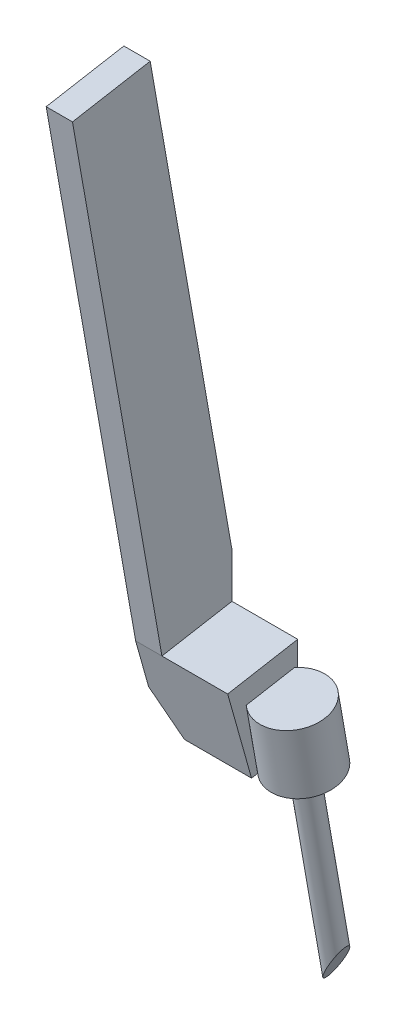
ISO-10303-21;
HEADER;
FILE_DESCRIPTION(('STEP AP214'),'2;1');
FILE_NAME('part.step','',(''),(''),'','','');
FILE_SCHEMA(('AUTOMOTIVE_DESIGN { 1 0 10303 214 1 1 1 1 }'));
ENDSEC;
DATA;
#1=APPLICATION_CONTEXT('core data for automotive mechanical design processes');
#2=APPLICATION_PROTOCOL_DEFINITION('international standard','automotive_design',2000,#1);
#3=PRODUCT_CONTEXT('',#1,'mechanical');
#4=PRODUCT('Part','Part','',(#3));
#5=PRODUCT_RELATED_PRODUCT_CATEGORY('part','',(#4));
#6=PRODUCT_DEFINITION_FORMATION('','',#4);
#7=PRODUCT_DEFINITION_CONTEXT('part definition',#1,'design');
#8=PRODUCT_DEFINITION('design','',#6,#7);
#9=PRODUCT_DEFINITION_SHAPE('','',#8);
#10=(LENGTH_UNIT() NAMED_UNIT(*) SI_UNIT(.MILLI.,.METRE.));
#11=(NAMED_UNIT(*) PLANE_ANGLE_UNIT() SI_UNIT($,.RADIAN.));
#12=(NAMED_UNIT(*) SI_UNIT($,.STERADIAN.) SOLID_ANGLE_UNIT());
#13=UNCERTAINTY_MEASURE_WITH_UNIT(LENGTH_MEASURE(1.E-05),#10,'distance_accuracy_value','');
#14=(GEOMETRIC_REPRESENTATION_CONTEXT(3) GLOBAL_UNCERTAINTY_ASSIGNED_CONTEXT((#13)) GLOBAL_UNIT_ASSIGNED_CONTEXT((#10,
#11,#12)) REPRESENTATION_CONTEXT('',''));
#15=CARTESIAN_POINT('',(0.,0.,0.));
#16=DIRECTION('',(0.,0.,1.));
#17=DIRECTION('',(1.,0.,0.));
#18=AXIS2_PLACEMENT_3D('',#15,#16,#17);
#19=CARTESIAN_POINT('',(-66.04,78.2084154122397,31.8445389149622));
#20=DIRECTION('',(0.,0.984807753012208,0.17364817766693));
#21=DIRECTION('',(0.,-0.17364817766693,0.984807753012208));
#22=AXIS2_PLACEMENT_3D('',#19,#20,#21);
#23=PLANE('',#22);
#24=DIRECTION('',(-1.,0.,0.));
#25=VECTOR('',#24,1.);
#26=CARTESIAN_POINT('',(-66.04,82.9277257491693,5.08));
#27=LINE('',#26,#25);
#28=CARTESIAN_POINT('',(-16.5707845942965,82.9277257491693,5.08));
#29=VERTEX_POINT('',#28);
#30=CARTESIAN_POINT('',(-51.5829650001151,82.9277257491693,5.08));
#31=VERTEX_POINT('',#30);
#32=EDGE_CURVE('E172',#29,#31,#27,.T.);
#33=ORIENTED_EDGE('',*,*,#32,.F.);
#34=CARTESIAN_POINT('',(0.,81.2958800111578,14.3346570664051));
#35=DIRECTION('',(0.,0.984807753012208,0.17364817766693));
#36=DIRECTION('',(0.,-0.17364817766693,0.984807753012208));
#37=AXIS2_PLACEMENT_3D('',#34,#35,#36);
#38=CIRCLE('',#37,19.05);
#39=CARTESIAN_POINT('',(-12.7,78.8302440392632,28.3179735276063));
#40=VERTEX_POINT('',#39);
#41=EDGE_CURVE('E117',#40,#29,#38,.T.);
#42=ORIENTED_EDGE('',*,*,#41,.F.);
#43=DIRECTION('',(0.,-0.17364817766693,0.984807753012208));
#44=VECTOR('',#43,1.);
#45=CARTESIAN_POINT('',(-12.7,78.2084154122398,31.8445389149622));
#46=LINE('',#45,#44);
#47=CARTESIAN_POINT('',(-12.7,78.2084154122398,31.8445389149622));
#48=VERTEX_POINT('',#47);
#49=EDGE_CURVE('E112',#40,#48,#46,.T.);
#50=ORIENTED_EDGE('',*,*,#49,.T.);
#51=DIRECTION('',(1.,0.,0.));
#52=VECTOR('',#51,1.);
#53=CARTESIAN_POINT('',(-66.04,78.2084154122397,31.8445389149622));
#54=LINE('',#53,#52);
#55=CARTESIAN_POINT('',(-51.5829650001151,78.2084154122397,31.8445389149622));
#56=VERTEX_POINT('',#55);
#57=EDGE_CURVE('E196',#56,#48,#54,.T.);
#58=ORIENTED_EDGE('',*,*,#57,.F.);
#59=DIRECTION('',(0.,0.17364817766693,-0.984807753012208));
#60=VECTOR('',#59,1.);
#61=CARTESIAN_POINT('',(-51.5829650001151,78.2084154122397,31.8445389149622));
#62=LINE('',#61,#60);
#63=EDGE_CURVE('E163',#56,#31,#62,.T.);
#64=ORIENTED_EDGE('',*,*,#63,.T.);
#65=EDGE_LOOP('',(#33,#42,#50,#58,#64));
#66=FACE_BOUND('',#65,.T.);
#67=CARTESIAN_POINT('',(0.,81.2958800111578,14.3346570664051));
#68=DIRECTION('',(0.,0.984807753012208,0.17364817766693));
#69=DIRECTION('',(0.,-0.17364817766693,0.984807753012208));
#70=AXIS2_PLACEMENT_3D('',#67,#68,#69);
#71=CIRCLE('',#70,6.5);
#72=CARTESIAN_POINT('',(0.,80.1671668563227,20.7359074609845));
#73=VERTEX_POINT('',#72);
#74=EDGE_CURVE('E11',#73,#73,#71,.F.);
#75=ORIENTED_EDGE('',*,*,#74,.F.);
#76=EDGE_LOOP('',(#75));
#77=FACE_BOUND('',#76,.T.);
#78=ADVANCED_FACE('F34',(#66,#77),#23,.F.);
#79=CARTESIAN_POINT('',(-37.9019976077163,107.832873361256,5.08));
#80=DIRECTION('',(0.,0.,-1.));
#81=DIRECTION('',(-1.,0.,0.));
#82=AXIS2_PLACEMENT_3D('',#79,#80,#81);
#83=PLANE('',#82);
#84=CARTESIAN_POINT('',(0.,28.810111643658,5.08));
#85=DIRECTION('',(0.,0.,-1.));
#86=DIRECTION('',(0.,1.,0.));
#87=AXIS2_PLACEMENT_3D('',#84,#85,#86);
#88=ELLIPSE('',#87,109.704577703886,19.05);
#89=CARTESIAN_POINT('',(-12.7,110.579076039924,5.08000000000002));
#90=VERTEX_POINT('',#89);
#91=EDGE_CURVE('E133',#29,#90,#88,.T.);
#92=ORIENTED_EDGE('',*,*,#91,.F.);
#93=ORIENTED_EDGE('',*,*,#32,.T.);
#94=DIRECTION('',(0.524092216345197,-0.851661522417433,0.));
#95=VECTOR('',#94,1.);
#96=CARTESIAN_POINT('',(-58.9415695014176,94.8856219304001,5.08));
#97=LINE('',#96,#95);
#98=CARTESIAN_POINT('',(-66.04,106.420729563472,5.08));
#99=VERTEX_POINT('',#98);
#100=EDGE_CURVE('E166',#99,#31,#97,.T.);
#101=ORIENTED_EDGE('',*,*,#100,.F.);
#102=DIRECTION('',(0.,1.,0.));
#103=VECTOR('',#102,1.);
#104=CARTESIAN_POINT('',(-66.04,0.,5.08));
#105=LINE('',#104,#103);
#106=CARTESIAN_POINT('',(-66.04,160.455604888321,5.08000000000001));
#107=VERTEX_POINT('',#106);
#108=EDGE_CURVE('E201',#99,#107,#105,.T.);
#109=ORIENTED_EDGE('',*,*,#108,.T.);
#110=DIRECTION('',(1.,0.,0.));
#111=VECTOR('',#110,1.);
#112=CARTESIAN_POINT('',(-66.04,160.455604888321,5.08));
#113=LINE('',#112,#111);
#114=CARTESIAN_POINT('',(-50.8,160.455604888321,5.08));
#115=VERTEX_POINT('',#114);
#116=EDGE_CURVE('E169',#107,#115,#113,.T.);
#117=ORIENTED_EDGE('',*,*,#116,.T.);
#118=DIRECTION('',(0.,1.,0.));
#119=VECTOR('',#118,1.);
#120=CARTESIAN_POINT('',(-50.8,107.832873361256,5.08));
#121=LINE('',#120,#119);
#122=CARTESIAN_POINT('',(-50.8,134.511397632965,5.08));
#123=VERTEX_POINT('',#122);
#124=EDGE_CURVE('E158',#123,#115,#121,.T.);
#125=ORIENTED_EDGE('',*,*,#124,.F.);
#126=DIRECTION('',(-1.,0.,0.));
#127=VECTOR('',#126,1.);
#128=CARTESIAN_POINT('',(-37.9019976077163,134.511397632965,5.08));
#129=LINE('',#128,#127);
#130=CARTESIAN_POINT('',(-12.7,134.511397632965,5.08));
#131=VERTEX_POINT('',#130);
#132=EDGE_CURVE('E156',#131,#123,#129,.T.);
#133=ORIENTED_EDGE('',*,*,#132,.F.);
#134=DIRECTION('',(0.,1.,0.));
#135=VECTOR('',#134,1.);
#136=CARTESIAN_POINT('',(-12.7,107.832873361256,5.08));
#137=LINE('',#136,#135);
#138=EDGE_CURVE('E199',#90,#131,#137,.T.);
#139=ORIENTED_EDGE('',*,*,#138,.F.);
#140=EDGE_LOOP('',(#92,#93,#101,#109,#117,#125,#133,#139));
#141=FACE_BOUND('',#140,.T.);
#142=CARTESIAN_POINT('',(-37.9019976077163,107.832873361256,5.08));
#143=DIRECTION('',(0.,0.,-1.));
#144=DIRECTION('',(-1.,0.,0.));
#145=AXIS2_PLACEMENT_3D('',#142,#143,#144);
#146=CIRCLE('',#145,24.);
#147=CARTESIAN_POINT('',(-61.9019976077163,107.832873361256,5.08));
#148=VERTEX_POINT('',#147);
#149=EDGE_CURVE('E135',#148,#148,#146,.T.);
#150=ORIENTED_EDGE('',*,*,#149,.F.);
#151=EDGE_LOOP('',(#150));
#152=FACE_BOUND('',#151,.T.);
#153=ADVANCED_FACE('F36',(#141,#152),#83,.T.);
#154=CARTESIAN_POINT('',(-12.7,0.,0.));
#155=DIRECTION('',(1.,0.,0.));
#156=DIRECTION('',(0.,1.,0.));
#157=AXIS2_PLACEMENT_3D('',#154,#155,#156);
#158=PLANE('',#157);
#159=DIRECTION('',(0.,0.984807753012208,0.17364817766693));
#160=VECTOR('',#159,1.);
#161=CARTESIAN_POINT('',(-12.7,83.7615159830524,0.351340605203934));
#162=LINE('',#161,#160);
#163=CARTESIAN_POINT('',(-12.7,121.282691372818,6.96733617431399));
#164=VERTEX_POINT('',#163);
#165=EDGE_CURVE('E52',#90,#164,#162,.T.);
#166=ORIENTED_EDGE('',*,*,#165,.F.);
#167=ORIENTED_EDGE('',*,*,#138,.T.);
#168=DIRECTION('',(0.,0.17364817766693,-0.984807753012208));
#169=VECTOR('',#168,1.);
#170=CARTESIAN_POINT('',(-12.7,135.293711205644,0.643279258026118));
#171=LINE('',#170,#169);
#172=CARTESIAN_POINT('',(-12.7,127.354516522712,45.6686897257443));
#173=VERTEX_POINT('',#172);
#174=EDGE_CURVE('E139',#173,#131,#171,.T.);
#175=ORIENTED_EDGE('',*,*,#174,.F.);
#176=DIRECTION('',(0.,0.962641699975202,0.270778428736215));
#177=VECTOR('',#176,1.);
#178=CARTESIAN_POINT('',(-12.7,78.2084154122398,31.8445389149622));
#179=LINE('',#178,#177);
#180=EDGE_CURVE('E177',#48,#173,#179,.T.);
#181=ORIENTED_EDGE('',*,*,#180,.F.);
#182=ORIENTED_EDGE('',*,*,#49,.F.);
#183=DIRECTION('',(0.,0.984807753012208,0.17364817766693));
#184=VECTOR('',#183,1.);
#185=CARTESIAN_POINT('',(-12.7,78.8302440392633,28.3179735276063));
#186=LINE('',#185,#184);
#187=CARTESIAN_POINT('',(-12.7,116.351419429028,34.9339690967163));
#188=VERTEX_POINT('',#187);
#189=EDGE_CURVE('E109',#188,#40,#186,.F.);
#190=ORIENTED_EDGE('',*,*,#189,.F.);
#191=DIRECTION('',(0.,-0.17364817766693,0.984807753012208));
#192=VECTOR('',#191,1.);
#193=CARTESIAN_POINT('',(-12.7,118.817055400923,20.9506526355152));
#194=LINE('',#193,#192);
#195=EDGE_CURVE('E42',#164,#188,#194,.T.);
#196=ORIENTED_EDGE('',*,*,#195,.F.);
#197=EDGE_LOOP('',(#166,#167,#175,#181,#182,#190,#196));
#198=FACE_BOUND('',#197,.T.);
#199=ADVANCED_FACE('F110',(#198),#158,.T.);
#200=CARTESIAN_POINT('',(-66.04,135.293711205644,0.643279258026118));
#201=DIRECTION('',(0.,-0.17364817766693,0.984807753012208));
#202=DIRECTION('',(0.,-0.984807753012208,-0.17364817766693));
#203=AXIS2_PLACEMENT_3D('',#200,#201,#202);
#204=PLANE('',#203);
#205=DIRECTION('',(1.,0.,0.));
#206=VECTOR('',#205,1.);
#207=CARTESIAN_POINT('',(-66.0400000000001,429.209585092138,52.4685778827215));
#208=LINE('',#207,#206);
#209=CARTESIAN_POINT('',(-66.0400000000001,429.209585092138,52.4685778827215));
#210=VERTEX_POINT('',#209);
#211=CARTESIAN_POINT('',(-50.8000000000001,429.209585092138,52.4685778827215));
#212=VERTEX_POINT('',#211);
#213=EDGE_CURVE('E184',#210,#212,#208,.T.);
#214=ORIENTED_EDGE('',*,*,#213,.T.);
#215=DIRECTION('',(0.,0.984807753012208,0.173648177666931));
#216=VECTOR('',#215,1.);
#217=CARTESIAN_POINT('',(-50.8000000000001,429.209585092138,52.4685778827215));
#218=LINE('',#217,#216);
#219=EDGE_CURVE('E148',#115,#212,#218,.T.);
#220=ORIENTED_EDGE('',*,*,#219,.F.);
#221=ORIENTED_EDGE('',*,*,#116,.F.);
#222=DIRECTION('',(0.,-0.984807753012208,-0.173648177666931));
#223=VECTOR('',#222,1.);
#224=CARTESIAN_POINT('',(-66.04,135.293711205644,0.643279258026118));
#225=LINE('',#224,#223);
#226=EDGE_CURVE('E181',#210,#107,#225,.T.);
#227=ORIENTED_EDGE('',*,*,#226,.F.);
#228=EDGE_LOOP('',(#214,#220,#221,#227));
#229=FACE_BOUND('',#228,.T.);
#230=ADVANCED_FACE('F237',(#229),#204,.F.);
#231=CARTESIAN_POINT('',(-66.04,0.,0.));
#232=DIRECTION('',(1.,0.,0.));
#233=DIRECTION('',(0.,1.,0.));
#234=AXIS2_PLACEMENT_3D('',#231,#232,#233);
#235=PLANE('',#234);
#236=ORIENTED_EDGE('',*,*,#108,.F.);
#237=DIRECTION('',(0.,-0.17364817766693,0.984807753012208));
#238=VECTOR('',#237,1.);
#239=CARTESIAN_POINT('',(-66.04,104.080483080507,18.3521973322643));
#240=LINE('',#239,#238);
#241=CARTESIAN_POINT('',(-66.04,100.591264455003,38.1405394877563));
#242=VERTEX_POINT('',#241);
#243=EDGE_CURVE('E160',#99,#242,#240,.T.);
#244=ORIENTED_EDGE('',*,*,#243,.T.);
#245=DIRECTION('',(0.,0.962641699975202,0.270778428736215));
#246=VECTOR('',#245,1.);
#247=CARTESIAN_POINT('',(-66.04,78.2084154122397,31.8445389149622));
#248=LINE('',#247,#246);
#249=CARTESIAN_POINT('',(-66.04,127.354516522712,45.6686897257443));
#250=VERTEX_POINT('',#249);
#251=EDGE_CURVE('E174',#242,#250,#248,.T.);
#252=ORIENTED_EDGE('',*,*,#251,.T.);
#253=DIRECTION('',(0.,0.984807753012208,0.17364817766693));
#254=VECTOR('',#253,1.);
#255=CARTESIAN_POINT('',(-66.04,127.354516522712,45.6686897257443));
#256=LINE('',#255,#254);
#257=CARTESIAN_POINT('',(-66.0400000000001,421.270390409205,97.4939883504397));
#258=VERTEX_POINT('',#257);
#259=EDGE_CURVE('E176',#250,#258,#256,.T.);
#260=ORIENTED_EDGE('',*,*,#259,.T.);
#261=DIRECTION('',(0.,0.173648177666931,-0.984807753012208));
#262=VECTOR('',#261,1.);
#263=CARTESIAN_POINT('',(-66.0400000000001,421.270390409205,97.4939883504397));
#264=LINE('',#263,#262);
#265=EDGE_CURVE('E179',#258,#210,#264,.T.);
#266=ORIENTED_EDGE('',*,*,#265,.T.);
#267=ORIENTED_EDGE('',*,*,#226,.T.);
#268=EDGE_LOOP('',(#236,#244,#252,#260,#266,#267));
#269=FACE_BOUND('',#268,.T.);
#270=ADVANCED_FACE('F230',(#269),#235,.F.);
#271=CARTESIAN_POINT('',(-66.04,78.2084154122397,31.8445389149622));
#272=DIRECTION('',(0.,0.270778428736215,-0.962641699975202));
#273=DIRECTION('',(0.,0.962641699975202,0.270778428736215));
#274=AXIS2_PLACEMENT_3D('',#271,#272,#273);
#275=PLANE('',#274);
#276=ORIENTED_EDGE('',*,*,#251,.F.);
#277=DIRECTION('',(0.528023929906921,-0.817503721486964,-0.229953027378672));
#278=VECTOR('',#277,1.);
#279=CARTESIAN_POINT('',(-55.6137203828117,84.4489612267807,33.5999222420727));
#280=LINE('',#279,#278);
#281=EDGE_CURVE('E123',#242,#56,#280,.T.);
#282=ORIENTED_EDGE('',*,*,#281,.T.);
#283=ORIENTED_EDGE('',*,*,#57,.T.);
#284=ORIENTED_EDGE('',*,*,#180,.T.);
#285=DIRECTION('',(1.,0.,0.));
#286=VECTOR('',#285,1.);
#287=CARTESIAN_POINT('',(-50.8,127.354516522712,45.6686897257443));
#288=LINE('',#287,#286);
#289=CARTESIAN_POINT('',(-50.8,127.354516522712,45.6686897257443));
#290=VERTEX_POINT('',#289);
#291=EDGE_CURVE('E152',#290,#173,#288,.T.);
#292=ORIENTED_EDGE('',*,*,#291,.F.);
#293=DIRECTION('',(1.,0.,0.));
#294=VECTOR('',#293,1.);
#295=CARTESIAN_POINT('',(-66.04,127.354516522712,45.6686897257443));
#296=LINE('',#295,#294);
#297=EDGE_CURVE('E193',#250,#290,#296,.T.);
#298=ORIENTED_EDGE('',*,*,#297,.F.);
#299=EDGE_LOOP('',(#276,#282,#283,#284,#292,#298));
#300=FACE_BOUND('',#299,.T.);
#301=ADVANCED_FACE('F207',(#300),#275,.F.);
#302=CARTESIAN_POINT('',(-66.04,127.354516522712,45.6686897257443));
#303=DIRECTION('',(0.,0.17364817766693,-0.984807753012208));
#304=DIRECTION('',(0.,0.984807753012208,0.17364817766693));
#305=AXIS2_PLACEMENT_3D('',#302,#303,#304);
#306=PLANE('',#305);
#307=ORIENTED_EDGE('',*,*,#297,.T.);
#308=DIRECTION('',(0.,-0.984807753012208,-0.17364817766693));
#309=VECTOR('',#308,1.);
#310=CARTESIAN_POINT('',(-50.8,127.354516522712,45.6686897257443));
#311=LINE('',#310,#309);
#312=CARTESIAN_POINT('',(-50.8000000000001,421.270390409205,97.4939883504397));
#313=VERTEX_POINT('',#312);
#314=EDGE_CURVE('E142',#313,#290,#311,.T.);
#315=ORIENTED_EDGE('',*,*,#314,.F.);
#316=DIRECTION('',(1.,0.,0.));
#317=VECTOR('',#316,1.);
#318=CARTESIAN_POINT('',(-66.0400000000001,421.270390409205,97.4939883504397));
#319=LINE('',#318,#317);
#320=EDGE_CURVE('E190',#258,#313,#319,.T.);
#321=ORIENTED_EDGE('',*,*,#320,.F.);
#322=ORIENTED_EDGE('',*,*,#259,.F.);
#323=EDGE_LOOP('',(#307,#315,#321,#322));
#324=FACE_BOUND('',#323,.T.);
#325=ADVANCED_FACE('F225',(#324),#306,.F.);
#326=CARTESIAN_POINT('',(-66.0400000000001,421.270390409205,97.4939883504397));
#327=DIRECTION('',(0.,-0.984807753012208,-0.173648177666931));
#328=DIRECTION('',(0.,0.173648177666931,-0.984807753012208));
#329=AXIS2_PLACEMENT_3D('',#326,#327,#328);
#330=PLANE('',#329);
#331=ORIENTED_EDGE('',*,*,#320,.T.);
#332=DIRECTION('',(0.,-0.173648177666931,0.984807753012208));
#333=VECTOR('',#332,1.);
#334=CARTESIAN_POINT('',(-50.8000000000001,421.270390409205,97.4939883504397));
#335=LINE('',#334,#333);
#336=EDGE_CURVE('E150',#212,#313,#335,.T.);
#337=ORIENTED_EDGE('',*,*,#336,.F.);
#338=ORIENTED_EDGE('',*,*,#213,.F.);
#339=ORIENTED_EDGE('',*,*,#265,.F.);
#340=EDGE_LOOP('',(#331,#337,#338,#339));
#341=FACE_BOUND('',#340,.T.);
#342=ADVANCED_FACE('F242',(#341),#330,.F.);
#343=CARTESIAN_POINT('',(0.,12.832245373223,-72.775279890033));
#344=DIRECTION('',(0.848048096156425,0.521868599887386,0.0920195145446967));
#345=DIRECTION('',(-0.524092216345197,0.851661522417433,0.));
#346=AXIS2_PLACEMENT_3D('',#343,#344,#345);
#347=PLANE('',#346);
#348=ORIENTED_EDGE('',*,*,#100,.T.);
#349=ORIENTED_EDGE('',*,*,#63,.F.);
#350=ORIENTED_EDGE('',*,*,#281,.F.);
#351=ORIENTED_EDGE('',*,*,#243,.F.);
#352=EDGE_LOOP('',(#348,#349,#350,#351));
#353=FACE_BOUND('',#352,.T.);
#354=ADVANCED_FACE('F232',(#353),#347,.F.);
#355=CARTESIAN_POINT('',(-50.8,135.293711205644,0.643279258026118));
#356=DIRECTION('',(0.,-0.984807753012208,-0.17364817766693));
#357=DIRECTION('',(0.,0.17364817766693,-0.984807753012208));
#358=AXIS2_PLACEMENT_3D('',#355,#356,#357);
#359=PLANE('',#358);
#360=ORIENTED_EDGE('',*,*,#132,.T.);
#361=DIRECTION('',(0.,0.17364817766693,-0.984807753012208));
#362=VECTOR('',#361,1.);
#363=CARTESIAN_POINT('',(-50.8,135.293711205644,0.643279258026118));
#364=LINE('',#363,#362);
#365=EDGE_CURVE('E145',#290,#123,#364,.T.);
#366=ORIENTED_EDGE('',*,*,#365,.F.);
#367=ORIENTED_EDGE('',*,*,#291,.T.);
#368=ORIENTED_EDGE('',*,*,#174,.T.);
#369=EDGE_LOOP('',(#360,#366,#367,#368));
#370=FACE_BOUND('',#369,.T.);
#371=ADVANCED_FACE('F220',(#370),#359,.F.);
#372=CARTESIAN_POINT('',(-50.8,0.,0.));
#373=DIRECTION('',(-1.,0.,0.));
#374=DIRECTION('',(0.,-1.,0.));
#375=AXIS2_PLACEMENT_3D('',#372,#373,#374);
#376=PLANE('',#375);
#377=ORIENTED_EDGE('',*,*,#124,.T.);
#378=ORIENTED_EDGE('',*,*,#219,.T.);
#379=ORIENTED_EDGE('',*,*,#336,.T.);
#380=ORIENTED_EDGE('',*,*,#314,.T.);
#381=ORIENTED_EDGE('',*,*,#365,.T.);
#382=EDGE_LOOP('',(#377,#378,#379,#380,#381));
#383=FACE_BOUND('',#382,.T.);
#384=ADVANCED_FACE('F240',(#383),#376,.F.);
#385=CARTESIAN_POINT('',(-37.9019976077163,107.832873361256,4.826));
#386=DIRECTION('',(0.,0.,1.));
#387=DIRECTION('',(1.,0.,0.));
#388=AXIS2_PLACEMENT_3D('',#385,#386,#387);
#389=CYLINDRICAL_SURFACE('',#388,24.);
#390=CARTESIAN_POINT('',(-37.9019976077163,107.832873361256,4.826));
#391=DIRECTION('',(0.,0.,-1.));
#392=DIRECTION('',(-1.,0.,0.));
#393=AXIS2_PLACEMENT_3D('',#390,#391,#392);
#394=CIRCLE('',#393,24.);
#395=CARTESIAN_POINT('',(-61.9019976077163,107.832873361256,4.826));
#396=VERTEX_POINT('',#395);
#397=EDGE_CURVE('E136',#396,#396,#394,.T.);
#398=ORIENTED_EDGE('',*,*,#397,.F.);
#399=EDGE_LOOP('',(#398));
#400=FACE_BOUND('',#399,.T.);
#401=ORIENTED_EDGE('',*,*,#149,.T.);
#402=EDGE_LOOP('',(#401));
#403=FACE_BOUND('',#402,.T.);
#404=ADVANCED_FACE('F312',(#400,#403),#389,.T.);
#405=CARTESIAN_POINT('',(-37.9019976077163,107.832873361256,4.826));
#406=DIRECTION('',(0.,0.,-1.));
#407=DIRECTION('',(-1.,0.,0.));
#408=AXIS2_PLACEMENT_3D('',#405,#406,#407);
#409=PLANE('',#408);
#410=ORIENTED_EDGE('',*,*,#397,.T.);
#411=EDGE_LOOP('',(#410));
#412=FACE_BOUND('',#411,.T.);
#413=ADVANCED_FACE('F322',(#412),#409,.T.);
#414=CARTESIAN_POINT('',(0.,81.2958800111578,14.3346570664051));
#415=DIRECTION('',(0.,0.984807753012208,0.17364817766693));
#416=DIRECTION('',(0.,-0.17364817766693,0.984807753012208));
#417=AXIS2_PLACEMENT_3D('',#414,#415,#416);
#418=CYLINDRICAL_SURFACE('',#417,19.05);
#419=ORIENTED_EDGE('',*,*,#41,.T.);
#420=ORIENTED_EDGE('',*,*,#91,.T.);
#421=ORIENTED_EDGE('',*,*,#165,.T.);
#422=CARTESIAN_POINT('',(0.,118.817055400923,20.9506526355152));
#423=DIRECTION('',(0.,0.984807753012208,0.17364817766693));
#424=DIRECTION('',(0.,-0.17364817766693,0.984807753012208));
#425=AXIS2_PLACEMENT_3D('',#422,#423,#424);
#426=CIRCLE('',#425,19.05);
#427=EDGE_CURVE('E122',#188,#164,#426,.T.);
#428=ORIENTED_EDGE('',*,*,#427,.F.);
#429=ORIENTED_EDGE('',*,*,#189,.T.);
#430=EDGE_LOOP('',(#419,#420,#421,#428,#429));
#431=FACE_BOUND('',#430,.T.);
#432=ADVANCED_FACE('F124',(#431),#418,.T.);
#433=CARTESIAN_POINT('',(0.,118.817055400923,20.9506526355152));
#434=DIRECTION('',(0.,0.984807753012208,0.17364817766693));
#435=DIRECTION('',(0.,-0.17364817766693,0.984807753012208));
#436=AXIS2_PLACEMENT_3D('',#433,#434,#435);
#437=PLANE('',#436);
#438=ORIENTED_EDGE('',*,*,#427,.T.);
#439=ORIENTED_EDGE('',*,*,#195,.T.);
#440=EDGE_LOOP('',(#438,#439));
#441=FACE_BOUND('',#440,.T.);
#442=ADVANCED_FACE('F121',(#441),#437,.T.);
#443=CARTESIAN_POINT('',(0.,-36.8810503503072,-6.50312425362655));
#444=DIRECTION('',(0.,0.984807753012208,0.17364817766693));
#445=DIRECTION('',(0.,-0.17364817766693,0.984807753012208));
#446=AXIS2_PLACEMENT_3D('',#443,#444,#445);
#447=CYLINDRICAL_SURFACE('',#446,6.5);
#448=CARTESIAN_POINT('',(0.,-25.7937594349255,-4.54813572228091));
#449=DIRECTION('',(-0.866025403784436,0.492403876506108,0.0868240888334659));
#450=DIRECTION('',(0.500000000000004,0.852868531952441,0.150383733180435));
#451=AXIS2_PLACEMENT_3D('',#448,#449,#450);
#452=ELLIPSE('',#451,12.9999999999999,6.5);
#453=CARTESIAN_POINT('',(6.5,-14.7064685195439,-2.59314719093527));
#454=VERTEX_POINT('',#453);
#455=EDGE_CURVE('E126',#454,#454,#452,.T.);
#456=ORIENTED_EDGE('',*,*,#455,.T.);
#457=EDGE_LOOP('',(#456));
#458=FACE_BOUND('',#457,.T.);
#459=ORIENTED_EDGE('',*,*,#74,.T.);
#460=EDGE_LOOP('',(#459));
#461=FACE_BOUND('',#460,.T.);
#462=ADVANCED_FACE('F351',(#458,#461),#447,.T.);
#463=CARTESIAN_POINT('',(-6.49999999999999,-21.7320197117162,-92.4175462990993));
#464=DIRECTION('',(-0.866025403784436,0.492403876506108,0.0868240888334659));
#465=DIRECTION('',(-0.494270410408073,-0.869308208517,0.));
#466=AXIS2_PLACEMENT_3D('',#463,#464,#465);
#467=PLANE('',#466);
#468=ORIENTED_EDGE('',*,*,#455,.F.);
#469=EDGE_LOOP('',(#468));
#470=FACE_BOUND('',#469,.T.);
#471=ADVANCED_FACE('F358',(#470),#467,.F.);
#472=CLOSED_SHELL('',(#78,#153,#199,#230,#270,#301,#325,#342,#354,#371,#384,#404,#413,#432,#442,
#462,#471));
#473=MANIFOLD_SOLID_BREP('B2',#472);
#474=ADVANCED_BREP_SHAPE_REPRESENTATION('',(#18,#473),#14);
#475=SHAPE_DEFINITION_REPRESENTATION(#9,#474);
ENDSEC;
END-ISO-10303-21;
